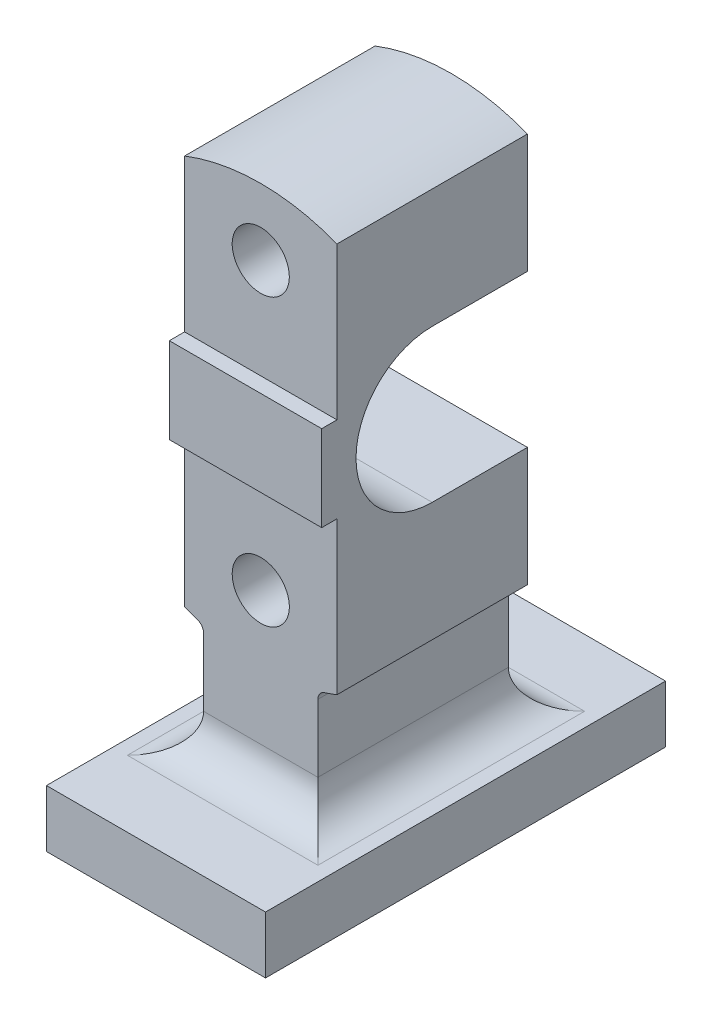
ISO-10303-21;
HEADER;
FILE_DESCRIPTION(('STEP AP214'),'2;1');
FILE_NAME('part.step','',(''),(''),'','','');
FILE_SCHEMA(('AUTOMOTIVE_DESIGN { 1 0 10303 214 1 1 1 1 }'));
ENDSEC;
DATA;
#1=APPLICATION_CONTEXT('core data for automotive mechanical design processes');
#2=APPLICATION_PROTOCOL_DEFINITION('international standard','automotive_design',2000,#1);
#3=PRODUCT_CONTEXT('',#1,'mechanical');
#4=PRODUCT('Part','Part','',(#3));
#5=PRODUCT_RELATED_PRODUCT_CATEGORY('part','',(#4));
#6=PRODUCT_DEFINITION_FORMATION('','',#4);
#7=PRODUCT_DEFINITION_CONTEXT('part definition',#1,'design');
#8=PRODUCT_DEFINITION('design','',#6,#7);
#9=PRODUCT_DEFINITION_SHAPE('','',#8);
#10=(LENGTH_UNIT() NAMED_UNIT(*) SI_UNIT(.MILLI.,.METRE.));
#11=(NAMED_UNIT(*) PLANE_ANGLE_UNIT() SI_UNIT($,.RADIAN.));
#12=(NAMED_UNIT(*) SI_UNIT($,.STERADIAN.) SOLID_ANGLE_UNIT());
#13=UNCERTAINTY_MEASURE_WITH_UNIT(LENGTH_MEASURE(1.E-05),#10,'distance_accuracy_value','');
#14=(GEOMETRIC_REPRESENTATION_CONTEXT(3) GLOBAL_UNCERTAINTY_ASSIGNED_CONTEXT((#13)) GLOBAL_UNIT_ASSIGNED_CONTEXT((#10,
#11,#12)) REPRESENTATION_CONTEXT('',''));
#15=CARTESIAN_POINT('',(0.,0.,0.));
#16=DIRECTION('',(0.,0.,1.));
#17=DIRECTION('',(1.,0.,0.));
#18=AXIS2_PLACEMENT_3D('',#15,#16,#17);
#19=CARTESIAN_POINT('',(0.,0.,0.));
#20=DIRECTION('',(0.,0.,1.));
#21=DIRECTION('',(1.,0.,0.));
#22=AXIS2_PLACEMENT_3D('',#19,#20,#21);
#23=PLANE('',#22);
#24=CARTESIAN_POINT('',(0.,-75.,0.));
#25=DIRECTION('',(0.,0.,1.));
#26=DIRECTION('',(-1.,0.,0.));
#27=AXIS2_PLACEMENT_3D('',#24,#25,#26);
#28=CIRCLE('',#27,15.);
#29=CARTESIAN_POINT('',(-15.,-75.,0.));
#30=VERTEX_POINT('',#29);
#31=EDGE_CURVE('E320',#30,#30,#28,.T.);
#32=ORIENTED_EDGE('',*,*,#31,.T.);
#33=EDGE_LOOP('',(#32));
#34=FACE_BOUND('',#33,.T.);
#35=DIRECTION('',(0.,-1.,0.));
#36=VECTOR('',#35,1.);
#37=CARTESIAN_POINT('',(-40.,102.469507659596,0.));
#38=LINE('',#37,#36);
#39=CARTESIAN_POINT('',(-40.,-40.,0.));
#40=VERTEX_POINT('',#39);
#41=CARTESIAN_POINT('',(-40.,-102.469507659596,0.));
#42=VERTEX_POINT('',#41);
#43=EDGE_CURVE('E397',#40,#42,#38,.T.);
#44=ORIENTED_EDGE('',*,*,#43,.F.);
#45=DIRECTION('',(1.,0.,0.));
#46=VECTOR('',#45,1.);
#47=CARTESIAN_POINT('',(0.,-40.,0.));
#48=LINE('',#47,#46);
#49=CARTESIAN_POINT('',(40.,-40.,0.));
#50=VERTEX_POINT('',#49);
#51=EDGE_CURVE('E213',#40,#50,#48,.T.);
#52=ORIENTED_EDGE('',*,*,#51,.T.);
#53=DIRECTION('',(0.,1.,0.));
#54=VECTOR('',#53,1.);
#55=CARTESIAN_POINT('',(40.,102.469507659596,0.));
#56=LINE('',#55,#54);
#57=CARTESIAN_POINT('',(40.,-102.469507659596,0.));
#58=VERTEX_POINT('',#57);
#59=EDGE_CURVE('E390',#58,#50,#56,.T.);
#60=ORIENTED_EDGE('',*,*,#59,.F.);
#61=CARTESIAN_POINT('',(0.,0.,0.));
#62=DIRECTION('',(0.,0.,1.));
#63=DIRECTION('',(1.,0.,0.));
#64=AXIS2_PLACEMENT_3D('',#61,#62,#63);
#65=CIRCLE('',#64,110.);
#66=CARTESIAN_POINT('',(33.4782608695652,-104.781706653162,0.));
#67=VERTEX_POINT('',#66);
#68=EDGE_CURVE('E386',#67,#58,#65,.T.);
#69=ORIENTED_EDGE('',*,*,#68,.F.);
#70=CARTESIAN_POINT('',(35.,-109.544511501033,0.));
#71=DIRECTION('',(0.,0.,-1.));
#72=DIRECTION('',(-1.,0.,0.));
#73=AXIS2_PLACEMENT_3D('',#70,#71,#72);
#74=CIRCLE('',#73,5.);
#75=CARTESIAN_POINT('',(30.,-109.544511501033,0.));
#76=VERTEX_POINT('',#75);
#77=EDGE_CURVE('E383',#76,#67,#74,.T.);
#78=ORIENTED_EDGE('',*,*,#77,.F.);
#79=DIRECTION('',(0.,1.,0.));
#80=VECTOR('',#79,1.);
#81=CARTESIAN_POINT('',(30.,-165.,0.));
#82=LINE('',#81,#80);
#83=CARTESIAN_POINT('',(30.,-145.,0.));
#84=VERTEX_POINT('',#83);
#85=EDGE_CURVE('E380',#84,#76,#82,.T.);
#86=ORIENTED_EDGE('',*,*,#85,.F.);
#87=DIRECTION('',(1.,0.,0.));
#88=VECTOR('',#87,1.);
#89=CARTESIAN_POINT('',(-30.,-145.,0.));
#90=LINE('',#89,#88);
#91=CARTESIAN_POINT('',(-30.,-145.,0.));
#92=VERTEX_POINT('',#91);
#93=EDGE_CURVE('E444',#84,#92,#90,.F.);
#94=ORIENTED_EDGE('',*,*,#93,.T.);
#95=DIRECTION('',(0.,-1.,0.));
#96=VECTOR('',#95,1.);
#97=CARTESIAN_POINT('',(-30.,-165.,0.));
#98=LINE('',#97,#96);
#99=CARTESIAN_POINT('',(-30.,-109.544511501033,0.));
#100=VERTEX_POINT('',#99);
#101=EDGE_CURVE('E376',#100,#92,#98,.T.);
#102=ORIENTED_EDGE('',*,*,#101,.F.);
#103=CARTESIAN_POINT('',(-35.,-109.544511501033,0.));
#104=DIRECTION('',(0.,0.,-1.));
#105=DIRECTION('',(1.,0.,0.));
#106=AXIS2_PLACEMENT_3D('',#103,#104,#105);
#107=CIRCLE('',#106,5.);
#108=CARTESIAN_POINT('',(-33.4782608695652,-104.781706653162,0.));
#109=VERTEX_POINT('',#108);
#110=EDGE_CURVE('E373',#109,#100,#107,.T.);
#111=ORIENTED_EDGE('',*,*,#110,.F.);
#112=CARTESIAN_POINT('',(0.,0.,0.));
#113=DIRECTION('',(0.,0.,1.));
#114=DIRECTION('',(1.,0.,0.));
#115=AXIS2_PLACEMENT_3D('',#112,#113,#114);
#116=CIRCLE('',#115,110.);
#117=EDGE_CURVE('E333',#42,#109,#116,.T.);
#118=ORIENTED_EDGE('',*,*,#117,.F.);
#119=EDGE_LOOP('',(#44,#52,#60,#69,#78,#86,#94,#102,#111,#118));
#120=FACE_BOUND('',#119,.T.);
#121=ADVANCED_FACE('F39',(#34,#120),#23,.F.);
#122=CARTESIAN_POINT('',(0.,0.,100.));
#123=DIRECTION('',(0.,0.,1.));
#124=DIRECTION('',(1.,0.,0.));
#125=AXIS2_PLACEMENT_3D('',#122,#123,#124);
#126=PLANE('',#125);
#127=CARTESIAN_POINT('',(0.,75.,100.));
#128=DIRECTION('',(0.,0.,1.));
#129=DIRECTION('',(1.,0.,0.));
#130=AXIS2_PLACEMENT_3D('',#127,#128,#129);
#131=CIRCLE('',#130,15.);
#132=CARTESIAN_POINT('',(15.,75.,100.));
#133=VERTEX_POINT('',#132);
#134=EDGE_CURVE('E329',#133,#133,#131,.T.);
#135=ORIENTED_EDGE('',*,*,#134,.F.);
#136=EDGE_LOOP('',(#135));
#137=FACE_BOUND('',#136,.T.);
#138=DIRECTION('',(0.,-1.,0.));
#139=VECTOR('',#138,1.);
#140=CARTESIAN_POINT('',(-40.,102.469507659596,100.));
#141=LINE('',#140,#139);
#142=CARTESIAN_POINT('',(-40.,102.469507659596,100.));
#143=VERTEX_POINT('',#142);
#144=CARTESIAN_POINT('',(-40.,22.5,100.));
#145=VERTEX_POINT('',#144);
#146=EDGE_CURVE('E366',#143,#145,#141,.T.);
#147=ORIENTED_EDGE('',*,*,#146,.T.);
#148=DIRECTION('',(-1.,0.,0.));
#149=VECTOR('',#148,1.);
#150=CARTESIAN_POINT('',(-40.,22.5,100.));
#151=LINE('',#150,#149);
#152=CARTESIAN_POINT('',(40.,22.5,100.));
#153=VERTEX_POINT('',#152);
#154=EDGE_CURVE('E63',#153,#145,#151,.T.);
#155=ORIENTED_EDGE('',*,*,#154,.F.);
#156=DIRECTION('',(0.,1.,0.));
#157=VECTOR('',#156,1.);
#158=CARTESIAN_POINT('',(40.,102.469507659596,100.));
#159=LINE('',#158,#157);
#160=CARTESIAN_POINT('',(40.,102.469507659596,100.));
#161=VERTEX_POINT('',#160);
#162=EDGE_CURVE('E358',#153,#161,#159,.T.);
#163=ORIENTED_EDGE('',*,*,#162,.T.);
#164=CARTESIAN_POINT('',(0.,0.,100.));
#165=DIRECTION('',(0.,0.,1.));
#166=DIRECTION('',(1.,0.,0.));
#167=AXIS2_PLACEMENT_3D('',#164,#165,#166);
#168=CIRCLE('',#167,110.);
#169=EDGE_CURVE('E362',#161,#143,#168,.T.);
#170=ORIENTED_EDGE('',*,*,#169,.T.);
#171=EDGE_LOOP('',(#147,#155,#163,#170));
#172=FACE_BOUND('',#171,.T.);
#173=ADVANCED_FACE('F565',(#137,#172),#126,.T.);
#174=CARTESIAN_POINT('',(0.,-75.,100.));
#175=DIRECTION('',(0.,0.,1.));
#176=DIRECTION('',(-1.,0.,0.));
#177=AXIS2_PLACEMENT_3D('',#174,#175,#176);
#178=CIRCLE('',#177,15.);
#179=CARTESIAN_POINT('',(-15.,-75.,100.));
#180=VERTEX_POINT('',#179);
#181=EDGE_CURVE('E321',#180,#180,#178,.T.);
#182=ORIENTED_EDGE('',*,*,#181,.F.);
#183=EDGE_LOOP('',(#182));
#184=FACE_BOUND('',#183,.T.);
#185=CARTESIAN_POINT('',(40.,-102.469507659596,100.));
#186=VERTEX_POINT('',#185);
#187=CARTESIAN_POINT('',(40.,-22.5,100.));
#188=VERTEX_POINT('',#187);
#189=EDGE_CURVE('E359',#186,#188,#159,.T.);
#190=ORIENTED_EDGE('',*,*,#189,.T.);
#191=DIRECTION('',(1.,0.,0.));
#192=VECTOR('',#191,1.);
#193=CARTESIAN_POINT('',(-40.,-22.5,100.));
#194=LINE('',#193,#192);
#195=CARTESIAN_POINT('',(-40.,-22.5,100.));
#196=VERTEX_POINT('',#195);
#197=EDGE_CURVE('E246',#196,#188,#194,.T.);
#198=ORIENTED_EDGE('',*,*,#197,.F.);
#199=CARTESIAN_POINT('',(-40.,-102.469507659596,100.));
#200=VERTEX_POINT('',#199);
#201=EDGE_CURVE('E365',#196,#200,#141,.T.);
#202=ORIENTED_EDGE('',*,*,#201,.T.);
#203=CARTESIAN_POINT('',(0.,0.,100.));
#204=DIRECTION('',(0.,0.,1.));
#205=DIRECTION('',(1.,0.,0.));
#206=AXIS2_PLACEMENT_3D('',#203,#204,#205);
#207=CIRCLE('',#206,110.);
#208=CARTESIAN_POINT('',(-33.4782608695652,-104.781706653162,100.));
#209=VERTEX_POINT('',#208);
#210=EDGE_CURVE('E337',#200,#209,#207,.T.);
#211=ORIENTED_EDGE('',*,*,#210,.T.);
#212=CARTESIAN_POINT('',(-35.,-109.544511501033,100.));
#213=DIRECTION('',(0.,0.,-1.));
#214=DIRECTION('',(1.,0.,0.));
#215=AXIS2_PLACEMENT_3D('',#212,#213,#214);
#216=CIRCLE('',#215,5.);
#217=CARTESIAN_POINT('',(-30.,-109.544511501033,100.));
#218=VERTEX_POINT('',#217);
#219=EDGE_CURVE('E341',#209,#218,#216,.T.);
#220=ORIENTED_EDGE('',*,*,#219,.T.);
#221=DIRECTION('',(0.,-1.,0.));
#222=VECTOR('',#221,1.);
#223=CARTESIAN_POINT('',(-30.,-165.,100.));
#224=LINE('',#223,#222);
#225=CARTESIAN_POINT('',(-30.,-145.,100.));
#226=VERTEX_POINT('',#225);
#227=EDGE_CURVE('E345',#218,#226,#224,.T.);
#228=ORIENTED_EDGE('',*,*,#227,.T.);
#229=DIRECTION('',(1.,0.,0.));
#230=VECTOR('',#229,1.);
#231=CARTESIAN_POINT('',(0.,-145.,100.));
#232=LINE('',#231,#230);
#233=CARTESIAN_POINT('',(30.,-145.,100.));
#234=VERTEX_POINT('',#233);
#235=EDGE_CURVE('E48',#226,#234,#232,.T.);
#236=ORIENTED_EDGE('',*,*,#235,.T.);
#237=DIRECTION('',(0.,1.,0.));
#238=VECTOR('',#237,1.);
#239=CARTESIAN_POINT('',(30.,-165.,100.));
#240=LINE('',#239,#238);
#241=CARTESIAN_POINT('',(30.,-109.544511501033,100.));
#242=VERTEX_POINT('',#241);
#243=EDGE_CURVE('E349',#234,#242,#240,.T.);
#244=ORIENTED_EDGE('',*,*,#243,.T.);
#245=CARTESIAN_POINT('',(35.,-109.544511501033,100.));
#246=DIRECTION('',(0.,0.,-1.));
#247=DIRECTION('',(-1.,0.,0.));
#248=AXIS2_PLACEMENT_3D('',#245,#246,#247);
#249=CIRCLE('',#248,5.);
#250=CARTESIAN_POINT('',(33.4782608695652,-104.781706653162,100.));
#251=VERTEX_POINT('',#250);
#252=EDGE_CURVE('E352',#242,#251,#249,.T.);
#253=ORIENTED_EDGE('',*,*,#252,.T.);
#254=CARTESIAN_POINT('',(0.,0.,100.));
#255=DIRECTION('',(0.,0.,1.));
#256=DIRECTION('',(1.,0.,0.));
#257=AXIS2_PLACEMENT_3D('',#254,#255,#256);
#258=CIRCLE('',#257,110.);
#259=EDGE_CURVE('E355',#251,#186,#258,.T.);
#260=ORIENTED_EDGE('',*,*,#259,.T.);
#261=EDGE_LOOP('',(#190,#198,#202,#211,#220,#228,#236,#244,#253,#260));
#262=FACE_BOUND('',#261,.T.);
#263=ADVANCED_FACE('F479',(#184,#262),#126,.T.);
#264=CARTESIAN_POINT('',(40.,40.,0.));
#265=VERTEX_POINT('',#264);
#266=CARTESIAN_POINT('',(40.,102.469507659596,0.));
#267=VERTEX_POINT('',#266);
#268=EDGE_CURVE('E389',#265,#267,#56,.T.);
#269=ORIENTED_EDGE('',*,*,#268,.F.);
#270=DIRECTION('',(-1.,0.,0.));
#271=VECTOR('',#270,1.);
#272=CARTESIAN_POINT('',(0.,40.,0.));
#273=LINE('',#272,#271);
#274=CARTESIAN_POINT('',(-40.,40.,0.));
#275=VERTEX_POINT('',#274);
#276=EDGE_CURVE('E230',#265,#275,#273,.T.);
#277=ORIENTED_EDGE('',*,*,#276,.T.);
#278=CARTESIAN_POINT('',(-40.,102.469507659596,0.));
#279=VERTEX_POINT('',#278);
#280=EDGE_CURVE('E342',#279,#275,#38,.T.);
#281=ORIENTED_EDGE('',*,*,#280,.F.);
#282=CARTESIAN_POINT('',(0.,0.,0.));
#283=DIRECTION('',(0.,0.,1.));
#284=DIRECTION('',(1.,0.,0.));
#285=AXIS2_PLACEMENT_3D('',#282,#283,#284);
#286=CIRCLE('',#285,110.);
#287=EDGE_CURVE('E394',#267,#279,#286,.T.);
#288=ORIENTED_EDGE('',*,*,#287,.F.);
#289=EDGE_LOOP('',(#269,#277,#281,#288));
#290=FACE_BOUND('',#289,.T.);
#291=CARTESIAN_POINT('',(0.,75.,0.));
#292=DIRECTION('',(0.,0.,1.));
#293=DIRECTION('',(1.,0.,0.));
#294=AXIS2_PLACEMENT_3D('',#291,#292,#293);
#295=CIRCLE('',#294,15.);
#296=CARTESIAN_POINT('',(15.,75.,0.));
#297=VERTEX_POINT('',#296);
#298=EDGE_CURVE('E325',#297,#297,#295,.T.);
#299=ORIENTED_EDGE('',*,*,#298,.T.);
#300=EDGE_LOOP('',(#299));
#301=FACE_BOUND('',#300,.T.);
#302=ADVANCED_FACE('F568',(#290,#301),#23,.F.);
#303=CARTESIAN_POINT('',(0.,0.,100.));
#304=DIRECTION('',(0.,0.,-1.));
#305=DIRECTION('',(-1.,0.,0.));
#306=AXIS2_PLACEMENT_3D('',#303,#304,#305);
#307=CYLINDRICAL_SURFACE('',#306,110.);
#308=ORIENTED_EDGE('',*,*,#117,.T.);
#309=DIRECTION('',(0.,0.,-1.));
#310=VECTOR('',#309,1.);
#311=CARTESIAN_POINT('',(-33.4782608695652,-104.781706653162,100.));
#312=LINE('',#311,#310);
#313=EDGE_CURVE('E427',#209,#109,#312,.T.);
#314=ORIENTED_EDGE('',*,*,#313,.F.);
#315=ORIENTED_EDGE('',*,*,#210,.F.);
#316=DIRECTION('',(0.,0.,-1.));
#317=VECTOR('',#316,1.);
#318=CARTESIAN_POINT('',(-40.,-102.469507659596,100.));
#319=LINE('',#318,#317);
#320=EDGE_CURVE('E369',#200,#42,#319,.T.);
#321=ORIENTED_EDGE('',*,*,#320,.T.);
#322=EDGE_LOOP('',(#308,#314,#315,#321));
#323=FACE_BOUND('',#322,.T.);
#324=ADVANCED_FACE('F513',(#323),#307,.T.);
#325=CARTESIAN_POINT('',(-35.,-109.544511501033,100.));
#326=DIRECTION('',(0.,0.,-1.));
#327=DIRECTION('',(-1.,0.,0.));
#328=AXIS2_PLACEMENT_3D('',#325,#326,#327);
#329=CYLINDRICAL_SURFACE('',#328,5.);
#330=ORIENTED_EDGE('',*,*,#110,.T.);
#331=DIRECTION('',(0.,0.,-1.));
#332=VECTOR('',#331,1.);
#333=CARTESIAN_POINT('',(-30.,-109.544511501033,100.));
#334=LINE('',#333,#332);
#335=EDGE_CURVE('E423',#218,#100,#334,.T.);
#336=ORIENTED_EDGE('',*,*,#335,.F.);
#337=ORIENTED_EDGE('',*,*,#219,.F.);
#338=ORIENTED_EDGE('',*,*,#313,.T.);
#339=EDGE_LOOP('',(#330,#336,#337,#338));
#340=FACE_BOUND('',#339,.T.);
#341=ADVANCED_FACE('F515',(#340),#329,.F.);
#342=CARTESIAN_POINT('',(-30.,-165.,100.));
#343=DIRECTION('',(1.,0.,0.));
#344=DIRECTION('',(0.,0.,-1.));
#345=AXIS2_PLACEMENT_3D('',#342,#343,#344);
#346=PLANE('',#345);
#347=ORIENTED_EDGE('',*,*,#101,.T.);
#348=DIRECTION('',(0.,0.,-1.));
#349=VECTOR('',#348,1.);
#350=CARTESIAN_POINT('',(-30.,-145.,100.));
#351=LINE('',#350,#349);
#352=EDGE_CURVE('E448',#92,#226,#351,.F.);
#353=ORIENTED_EDGE('',*,*,#352,.T.);
#354=ORIENTED_EDGE('',*,*,#227,.F.);
#355=ORIENTED_EDGE('',*,*,#335,.T.);
#356=EDGE_LOOP('',(#347,#353,#354,#355));
#357=FACE_BOUND('',#356,.T.);
#358=ADVANCED_FACE('F519',(#357),#346,.F.);
#359=CARTESIAN_POINT('',(30.,-165.,100.));
#360=DIRECTION('',(-1.,0.,0.));
#361=DIRECTION('',(0.,0.,1.));
#362=AXIS2_PLACEMENT_3D('',#359,#360,#361);
#363=PLANE('',#362);
#364=ORIENTED_EDGE('',*,*,#243,.F.);
#365=DIRECTION('',(0.,0.,-1.));
#366=VECTOR('',#365,1.);
#367=CARTESIAN_POINT('',(30.,-145.,0.));
#368=LINE('',#367,#366);
#369=EDGE_CURVE('E451',#234,#84,#368,.T.);
#370=ORIENTED_EDGE('',*,*,#369,.T.);
#371=ORIENTED_EDGE('',*,*,#85,.T.);
#372=DIRECTION('',(0.,0.,-1.));
#373=VECTOR('',#372,1.);
#374=CARTESIAN_POINT('',(30.,-109.544511501033,100.));
#375=LINE('',#374,#373);
#376=EDGE_CURVE('E419',#242,#76,#375,.T.);
#377=ORIENTED_EDGE('',*,*,#376,.F.);
#378=EDGE_LOOP('',(#364,#370,#371,#377));
#379=FACE_BOUND('',#378,.T.);
#380=ADVANCED_FACE('F483',(#379),#363,.F.);
#381=CARTESIAN_POINT('',(35.,-109.544511501033,100.));
#382=DIRECTION('',(0.,0.,-1.));
#383=DIRECTION('',(-1.,0.,0.));
#384=AXIS2_PLACEMENT_3D('',#381,#382,#383);
#385=CYLINDRICAL_SURFACE('',#384,5.);
#386=ORIENTED_EDGE('',*,*,#77,.T.);
#387=DIRECTION('',(0.,0.,-1.));
#388=VECTOR('',#387,1.);
#389=CARTESIAN_POINT('',(33.4782608695652,-104.781706653162,100.));
#390=LINE('',#389,#388);
#391=EDGE_CURVE('E415',#251,#67,#390,.T.);
#392=ORIENTED_EDGE('',*,*,#391,.F.);
#393=ORIENTED_EDGE('',*,*,#252,.F.);
#394=ORIENTED_EDGE('',*,*,#376,.T.);
#395=EDGE_LOOP('',(#386,#392,#393,#394));
#396=FACE_BOUND('',#395,.T.);
#397=ADVANCED_FACE('F489',(#396),#385,.F.);
#398=CARTESIAN_POINT('',(0.,0.,100.));
#399=DIRECTION('',(0.,0.,-1.));
#400=DIRECTION('',(-1.,0.,0.));
#401=AXIS2_PLACEMENT_3D('',#398,#399,#400);
#402=CYLINDRICAL_SURFACE('',#401,110.);
#403=ORIENTED_EDGE('',*,*,#68,.T.);
#404=DIRECTION('',(0.,0.,-1.));
#405=VECTOR('',#404,1.);
#406=CARTESIAN_POINT('',(40.,-102.469507659596,100.));
#407=LINE('',#406,#405);
#408=EDGE_CURVE('E411',#186,#58,#407,.T.);
#409=ORIENTED_EDGE('',*,*,#408,.F.);
#410=ORIENTED_EDGE('',*,*,#259,.F.);
#411=ORIENTED_EDGE('',*,*,#391,.T.);
#412=EDGE_LOOP('',(#403,#409,#410,#411));
#413=FACE_BOUND('',#412,.T.);
#414=ADVANCED_FACE('F495',(#413),#402,.T.);
#415=CARTESIAN_POINT('',(40.,102.469507659596,100.));
#416=DIRECTION('',(-1.,0.,0.));
#417=DIRECTION('',(0.,0.,1.));
#418=AXIS2_PLACEMENT_3D('',#415,#416,#417);
#419=PLANE('',#418);
#420=ORIENTED_EDGE('',*,*,#59,.T.);
#421=DIRECTION('',(0.,0.,1.));
#422=VECTOR('',#421,1.);
#423=CARTESIAN_POINT('',(40.,-40.,100.));
#424=LINE('',#423,#422);
#425=CARTESIAN_POINT('',(40.,-40.,50.));
#426=VERTEX_POINT('',#425);
#427=EDGE_CURVE('E234',#50,#426,#424,.T.);
#428=ORIENTED_EDGE('',*,*,#427,.T.);
#429=CARTESIAN_POINT('',(40.,0.,50.));
#430=DIRECTION('',(-1.,0.,0.));
#431=DIRECTION('',(0.,0.,1.));
#432=AXIS2_PLACEMENT_3D('',#429,#430,#431);
#433=CIRCLE('',#432,40.);
#434=CARTESIAN_POINT('',(40.,40.,50.));
#435=VERTEX_POINT('',#434);
#436=EDGE_CURVE('E204',#426,#435,#433,.T.);
#437=ORIENTED_EDGE('',*,*,#436,.T.);
#438=DIRECTION('',(0.,0.,-1.));
#439=VECTOR('',#438,1.);
#440=CARTESIAN_POINT('',(40.,40.,100.));
#441=LINE('',#440,#439);
#442=EDGE_CURVE('E208',#435,#265,#441,.T.);
#443=ORIENTED_EDGE('',*,*,#442,.T.);
#444=ORIENTED_EDGE('',*,*,#268,.T.);
#445=DIRECTION('',(0.,0.,-1.));
#446=VECTOR('',#445,1.);
#447=CARTESIAN_POINT('',(40.,102.469507659596,100.));
#448=LINE('',#447,#446);
#449=EDGE_CURVE('E407',#161,#267,#448,.T.);
#450=ORIENTED_EDGE('',*,*,#449,.F.);
#451=ORIENTED_EDGE('',*,*,#162,.F.);
#452=DIRECTION('',(0.,0.,-1.));
#453=VECTOR('',#452,1.);
#454=CARTESIAN_POINT('',(40.,22.5,108.));
#455=LINE('',#454,#453);
#456=CARTESIAN_POINT('',(40.,22.5,108.));
#457=VERTEX_POINT('',#456);
#458=EDGE_CURVE('E272',#457,#153,#455,.T.);
#459=ORIENTED_EDGE('',*,*,#458,.F.);
#460=DIRECTION('',(0.,1.,0.));
#461=VECTOR('',#460,1.);
#462=CARTESIAN_POINT('',(40.,-22.5,108.));
#463=LINE('',#462,#461);
#464=CARTESIAN_POINT('',(40.,-22.5,108.));
#465=VERTEX_POINT('',#464);
#466=EDGE_CURVE('E241',#465,#457,#463,.T.);
#467=ORIENTED_EDGE('',*,*,#466,.F.);
#468=DIRECTION('',(0.,0.,-1.));
#469=VECTOR('',#468,1.);
#470=CARTESIAN_POINT('',(40.,-22.5,108.));
#471=LINE('',#470,#469);
#472=EDGE_CURVE('E255',#465,#188,#471,.T.);
#473=ORIENTED_EDGE('',*,*,#472,.T.);
#474=ORIENTED_EDGE('',*,*,#189,.F.);
#475=ORIENTED_EDGE('',*,*,#408,.T.);
#476=EDGE_LOOP('',(#420,#428,#437,#443,#444,#450,#451,#459,#467,#473,#474,#475));
#477=FACE_BOUND('',#476,.T.);
#478=ADVANCED_FACE('F499',(#477),#419,.F.);
#479=CARTESIAN_POINT('',(0.,0.,100.));
#480=DIRECTION('',(0.,0.,-1.));
#481=DIRECTION('',(-1.,0.,0.));
#482=AXIS2_PLACEMENT_3D('',#479,#480,#481);
#483=CYLINDRICAL_SURFACE('',#482,110.);
#484=ORIENTED_EDGE('',*,*,#287,.T.);
#485=DIRECTION('',(0.,0.,-1.));
#486=VECTOR('',#485,1.);
#487=CARTESIAN_POINT('',(-40.,102.469507659596,100.));
#488=LINE('',#487,#486);
#489=EDGE_CURVE('E403',#143,#279,#488,.T.);
#490=ORIENTED_EDGE('',*,*,#489,.F.);
#491=ORIENTED_EDGE('',*,*,#169,.F.);
#492=ORIENTED_EDGE('',*,*,#449,.T.);
#493=EDGE_LOOP('',(#484,#490,#491,#492));
#494=FACE_BOUND('',#493,.T.);
#495=ADVANCED_FACE('F598',(#494),#483,.T.);
#496=CARTESIAN_POINT('',(-40.,102.469507659596,100.));
#497=DIRECTION('',(1.,0.,0.));
#498=DIRECTION('',(0.,0.,-1.));
#499=AXIS2_PLACEMENT_3D('',#496,#497,#498);
#500=PLANE('',#499);
#501=CARTESIAN_POINT('',(-40.,0.,50.));
#502=DIRECTION('',(-1.,0.,0.));
#503=DIRECTION('',(0.,0.,-1.));
#504=AXIS2_PLACEMENT_3D('',#501,#502,#503);
#505=CIRCLE('',#504,40.);
#506=CARTESIAN_POINT('',(-40.,-40.,50.));
#507=VERTEX_POINT('',#506);
#508=CARTESIAN_POINT('',(-40.,40.,50.));
#509=VERTEX_POINT('',#508);
#510=EDGE_CURVE('E55',#507,#509,#505,.T.);
#511=ORIENTED_EDGE('',*,*,#510,.F.);
#512=DIRECTION('',(0.,0.,-1.));
#513=VECTOR('',#512,1.);
#514=CARTESIAN_POINT('',(-40.,-40.,100.));
#515=LINE('',#514,#513);
#516=EDGE_CURVE('E11',#507,#40,#515,.T.);
#517=ORIENTED_EDGE('',*,*,#516,.T.);
#518=ORIENTED_EDGE('',*,*,#43,.T.);
#519=ORIENTED_EDGE('',*,*,#320,.F.);
#520=ORIENTED_EDGE('',*,*,#201,.F.);
#521=DIRECTION('',(0.,0.,-1.));
#522=VECTOR('',#521,1.);
#523=CARTESIAN_POINT('',(-40.,-22.5,108.));
#524=LINE('',#523,#522);
#525=CARTESIAN_POINT('',(-40.,-22.5,108.));
#526=VERTEX_POINT('',#525);
#527=EDGE_CURVE('E264',#526,#196,#524,.T.);
#528=ORIENTED_EDGE('',*,*,#527,.F.);
#529=DIRECTION('',(0.,-1.,0.));
#530=VECTOR('',#529,1.);
#531=CARTESIAN_POINT('',(-40.,-22.5,108.));
#532=LINE('',#531,#530);
#533=CARTESIAN_POINT('',(-40.,22.5,108.));
#534=VERTEX_POINT('',#533);
#535=EDGE_CURVE('E249',#534,#526,#532,.T.);
#536=ORIENTED_EDGE('',*,*,#535,.F.);
#537=DIRECTION('',(0.,0.,-1.));
#538=VECTOR('',#537,1.);
#539=CARTESIAN_POINT('',(-40.,22.5,108.));
#540=LINE('',#539,#538);
#541=EDGE_CURVE('E268',#534,#145,#540,.T.);
#542=ORIENTED_EDGE('',*,*,#541,.T.);
#543=ORIENTED_EDGE('',*,*,#146,.F.);
#544=ORIENTED_EDGE('',*,*,#489,.T.);
#545=ORIENTED_EDGE('',*,*,#280,.T.);
#546=DIRECTION('',(0.,0.,-1.));
#547=VECTOR('',#546,1.);
#548=CARTESIAN_POINT('',(-40.,40.,-70.));
#549=LINE('',#548,#547);
#550=EDGE_CURVE('E219',#509,#275,#549,.T.);
#551=ORIENTED_EDGE('',*,*,#550,.F.);
#552=EDGE_LOOP('',(#511,#517,#518,#519,#520,#528,#536,#542,#543,#544,#545,#551));
#553=FACE_BOUND('',#552,.T.);
#554=ADVANCED_FACE('F217',(#553),#500,.F.);
#555=CARTESIAN_POINT('',(0.,75.,100.));
#556=DIRECTION('',(0.,0.,-1.));
#557=DIRECTION('',(-1.,0.,0.));
#558=AXIS2_PLACEMENT_3D('',#555,#556,#557);
#559=CYLINDRICAL_SURFACE('',#558,15.);
#560=ORIENTED_EDGE('',*,*,#134,.T.);
#561=EDGE_LOOP('',(#560));
#562=FACE_BOUND('',#561,.T.);
#563=ORIENTED_EDGE('',*,*,#298,.F.);
#564=EDGE_LOOP('',(#563));
#565=FACE_BOUND('',#564,.T.);
#566=ADVANCED_FACE('F588',(#562,#565),#559,.F.);
#567=CARTESIAN_POINT('',(0.,-75.,100.));
#568=DIRECTION('',(0.,0.,-1.));
#569=DIRECTION('',(-1.,0.,0.));
#570=AXIS2_PLACEMENT_3D('',#567,#568,#569);
#571=CYLINDRICAL_SURFACE('',#570,15.);
#572=ORIENTED_EDGE('',*,*,#181,.T.);
#573=EDGE_LOOP('',(#572));
#574=FACE_BOUND('',#573,.T.);
#575=ORIENTED_EDGE('',*,*,#31,.F.);
#576=EDGE_LOOP('',(#575));
#577=FACE_BOUND('',#576,.T.);
#578=ADVANCED_FACE('F534',(#574,#577),#571,.F.);
#579=CARTESIAN_POINT('',(-57.5000000000001,-165.,155.));
#580=DIRECTION('',(0.,-1.,0.));
#581=DIRECTION('',(0.,0.,-1.));
#582=AXIS2_PLACEMENT_3D('',#579,#580,#581);
#583=PLANE('',#582);
#584=DIRECTION('',(0.,0.,-1.));
#585=VECTOR('',#584,1.);
#586=CARTESIAN_POINT('',(-50.,-165.,0.));
#587=LINE('',#586,#585);
#588=CARTESIAN_POINT('',(-50.,-165.,120.));
#589=VERTEX_POINT('',#588);
#590=CARTESIAN_POINT('',(-50.,-165.,-20.));
#591=VERTEX_POINT('',#590);
#592=EDGE_CURVE('E437',#589,#591,#587,.T.);
#593=ORIENTED_EDGE('',*,*,#592,.T.);
#594=DIRECTION('',(1.,0.,0.));
#595=VECTOR('',#594,1.);
#596=CARTESIAN_POINT('',(30.,-165.,-20.));
#597=LINE('',#596,#595);
#598=CARTESIAN_POINT('',(50.,-165.,-20.));
#599=VERTEX_POINT('',#598);
#600=EDGE_CURVE('E440',#591,#599,#597,.T.);
#601=ORIENTED_EDGE('',*,*,#600,.T.);
#602=DIRECTION('',(0.,0.,-1.));
#603=VECTOR('',#602,1.);
#604=CARTESIAN_POINT('',(50.,-165.,100.));
#605=LINE('',#604,#603);
#606=CARTESIAN_POINT('',(50.,-165.,120.));
#607=VERTEX_POINT('',#606);
#608=EDGE_CURVE('E434',#599,#607,#605,.F.);
#609=ORIENTED_EDGE('',*,*,#608,.T.);
#610=DIRECTION('',(1.,0.,0.));
#611=VECTOR('',#610,1.);
#612=CARTESIAN_POINT('',(-57.5000000000001,-165.,120.));
#613=LINE('',#612,#611);
#614=EDGE_CURVE('E431',#607,#589,#613,.F.);
#615=ORIENTED_EDGE('',*,*,#614,.T.);
#616=EDGE_LOOP('',(#593,#601,#609,#615));
#617=FACE_BOUND('',#616,.T.);
#618=DIRECTION('',(-1.,0.,0.));
#619=VECTOR('',#618,1.);
#620=CARTESIAN_POINT('',(-57.5000000000001,-165.,-55.));
#621=LINE('',#620,#619);
#622=CARTESIAN_POINT('',(57.4999999999999,-165.,-55.));
#623=VERTEX_POINT('',#622);
#624=CARTESIAN_POINT('',(-57.5000000000001,-165.,-55.));
#625=VERTEX_POINT('',#624);
#626=EDGE_CURVE('E296',#623,#625,#621,.T.);
#627=ORIENTED_EDGE('',*,*,#626,.T.);
#628=DIRECTION('',(0.,0.,-1.));
#629=VECTOR('',#628,1.);
#630=CARTESIAN_POINT('',(-57.5000000000001,-165.,155.));
#631=LINE('',#630,#629);
#632=CARTESIAN_POINT('',(-57.5000000000001,-165.,155.));
#633=VERTEX_POINT('',#632);
#634=EDGE_CURVE('E312',#633,#625,#631,.T.);
#635=ORIENTED_EDGE('',*,*,#634,.F.);
#636=DIRECTION('',(-1.,0.,0.));
#637=VECTOR('',#636,1.);
#638=CARTESIAN_POINT('',(-57.5000000000001,-165.,155.));
#639=LINE('',#638,#637);
#640=CARTESIAN_POINT('',(57.4999999999999,-165.,155.));
#641=VERTEX_POINT('',#640);
#642=EDGE_CURVE('E281',#641,#633,#639,.T.);
#643=ORIENTED_EDGE('',*,*,#642,.F.);
#644=DIRECTION('',(0.,0.,-1.));
#645=VECTOR('',#644,1.);
#646=CARTESIAN_POINT('',(57.4999999999999,-165.,155.));
#647=LINE('',#646,#645);
#648=EDGE_CURVE('E316',#641,#623,#647,.T.);
#649=ORIENTED_EDGE('',*,*,#648,.T.);
#650=EDGE_LOOP('',(#627,#635,#643,#649));
#651=FACE_BOUND('',#650,.T.);
#652=ADVANCED_FACE('F530',(#617,#651),#583,.F.);
#653=CARTESIAN_POINT('',(57.4999999999999,-195.,155.));
#654=DIRECTION('',(-1.,0.,0.));
#655=DIRECTION('',(0.,0.,1.));
#656=AXIS2_PLACEMENT_3D('',#653,#654,#655);
#657=PLANE('',#656);
#658=DIRECTION('',(0.,1.,0.));
#659=VECTOR('',#658,1.);
#660=CARTESIAN_POINT('',(57.4999999999999,-195.,-55.));
#661=LINE('',#660,#659);
#662=CARTESIAN_POINT('',(57.4999999999999,-195.,-55.));
#663=VERTEX_POINT('',#662);
#664=EDGE_CURVE('E292',#663,#623,#661,.T.);
#665=ORIENTED_EDGE('',*,*,#664,.T.);
#666=ORIENTED_EDGE('',*,*,#648,.F.);
#667=DIRECTION('',(0.,1.,0.));
#668=VECTOR('',#667,1.);
#669=CARTESIAN_POINT('',(57.4999999999999,-195.,155.));
#670=LINE('',#669,#668);
#671=CARTESIAN_POINT('',(57.4999999999999,-195.,155.));
#672=VERTEX_POINT('',#671);
#673=EDGE_CURVE('E277',#672,#641,#670,.T.);
#674=ORIENTED_EDGE('',*,*,#673,.F.);
#675=DIRECTION('',(0.,0.,-1.));
#676=VECTOR('',#675,1.);
#677=CARTESIAN_POINT('',(57.4999999999999,-195.,155.));
#678=LINE('',#677,#676);
#679=EDGE_CURVE('E291',#672,#663,#678,.T.);
#680=ORIENTED_EDGE('',*,*,#679,.T.);
#681=EDGE_LOOP('',(#665,#666,#674,#680));
#682=FACE_BOUND('',#681,.T.);
#683=ADVANCED_FACE('F533',(#682),#657,.F.);
#684=CARTESIAN_POINT('',(-57.5000000000001,-195.,155.));
#685=DIRECTION('',(1.,0.,0.));
#686=DIRECTION('',(0.,0.,-1.));
#687=AXIS2_PLACEMENT_3D('',#684,#685,#686);
#688=PLANE('',#687);
#689=DIRECTION('',(0.,-1.,0.));
#690=VECTOR('',#689,1.);
#691=CARTESIAN_POINT('',(-57.5000000000001,-195.,-55.));
#692=LINE('',#691,#690);
#693=CARTESIAN_POINT('',(-57.5000000000001,-195.,-55.));
#694=VERTEX_POINT('',#693);
#695=EDGE_CURVE('E300',#625,#694,#692,.T.);
#696=ORIENTED_EDGE('',*,*,#695,.T.);
#697=DIRECTION('',(0.,0.,-1.));
#698=VECTOR('',#697,1.);
#699=CARTESIAN_POINT('',(-57.5000000000001,-195.,155.));
#700=LINE('',#699,#698);
#701=CARTESIAN_POINT('',(-57.5000000000001,-195.,155.));
#702=VERTEX_POINT('',#701);
#703=EDGE_CURVE('E308',#702,#694,#700,.T.);
#704=ORIENTED_EDGE('',*,*,#703,.F.);
#705=DIRECTION('',(0.,-1.,0.));
#706=VECTOR('',#705,1.);
#707=CARTESIAN_POINT('',(-57.5000000000001,-195.,155.));
#708=LINE('',#707,#706);
#709=EDGE_CURVE('E285',#633,#702,#708,.T.);
#710=ORIENTED_EDGE('',*,*,#709,.F.);
#711=ORIENTED_EDGE('',*,*,#634,.T.);
#712=EDGE_LOOP('',(#696,#704,#710,#711));
#713=FACE_BOUND('',#712,.T.);
#714=ADVANCED_FACE('F543',(#713),#688,.F.);
#715=CARTESIAN_POINT('',(-57.5000000000001,-195.,155.));
#716=DIRECTION('',(0.,1.,0.));
#717=DIRECTION('',(0.,0.,1.));
#718=AXIS2_PLACEMENT_3D('',#715,#716,#717);
#719=PLANE('',#718);
#720=DIRECTION('',(1.,0.,0.));
#721=VECTOR('',#720,1.);
#722=CARTESIAN_POINT('',(-57.5000000000001,-195.,-55.));
#723=LINE('',#722,#721);
#724=EDGE_CURVE('E282',#694,#663,#723,.T.);
#725=ORIENTED_EDGE('',*,*,#724,.T.);
#726=ORIENTED_EDGE('',*,*,#679,.F.);
#727=DIRECTION('',(1.,0.,0.));
#728=VECTOR('',#727,1.);
#729=CARTESIAN_POINT('',(-57.5000000000001,-195.,155.));
#730=LINE('',#729,#728);
#731=EDGE_CURVE('E288',#702,#672,#730,.T.);
#732=ORIENTED_EDGE('',*,*,#731,.F.);
#733=ORIENTED_EDGE('',*,*,#703,.T.);
#734=EDGE_LOOP('',(#725,#726,#732,#733));
#735=FACE_BOUND('',#734,.T.);
#736=ADVANCED_FACE('F549',(#735),#719,.F.);
#737=CARTESIAN_POINT('',(0.,0.,155.));
#738=DIRECTION('',(0.,0.,-1.));
#739=DIRECTION('',(-1.,0.,0.));
#740=AXIS2_PLACEMENT_3D('',#737,#738,#739);
#741=PLANE('',#740);
#742=ORIENTED_EDGE('',*,*,#673,.T.);
#743=ORIENTED_EDGE('',*,*,#642,.T.);
#744=ORIENTED_EDGE('',*,*,#709,.T.);
#745=ORIENTED_EDGE('',*,*,#731,.T.);
#746=EDGE_LOOP('',(#742,#743,#744,#745));
#747=FACE_BOUND('',#746,.T.);
#748=ADVANCED_FACE('F554',(#747),#741,.F.);
#749=CARTESIAN_POINT('',(0.,0.,-55.));
#750=DIRECTION('',(0.,0.,-1.));
#751=DIRECTION('',(-1.,0.,0.));
#752=AXIS2_PLACEMENT_3D('',#749,#750,#751);
#753=PLANE('',#752);
#754=ORIENTED_EDGE('',*,*,#664,.F.);
#755=ORIENTED_EDGE('',*,*,#724,.F.);
#756=ORIENTED_EDGE('',*,*,#695,.F.);
#757=ORIENTED_EDGE('',*,*,#626,.F.);
#758=EDGE_LOOP('',(#754,#755,#756,#757));
#759=FACE_BOUND('',#758,.T.);
#760=ADVANCED_FACE('F546',(#759),#753,.T.);
#761=CARTESIAN_POINT('',(0.,-145.,120.));
#762=DIRECTION('',(1.,0.,0.));
#763=DIRECTION('',(0.,0.,-1.));
#764=AXIS2_PLACEMENT_3D('',#761,#762,#763);
#765=CYLINDRICAL_SURFACE('',#764,20.);
#766=CARTESIAN_POINT('',(50.,-145.,120.));
#767=DIRECTION('',(0.707106781186547,0.,-0.707106781186547));
#768=DIRECTION('',(0.707106781186547,0.,0.707106781186547));
#769=AXIS2_PLACEMENT_3D('',#766,#767,#768);
#770=ELLIPSE('',#769,28.2842712474619,20.);
#771=EDGE_CURVE('E461',#234,#607,#770,.F.);
#772=ORIENTED_EDGE('',*,*,#771,.F.);
#773=ORIENTED_EDGE('',*,*,#235,.F.);
#774=CARTESIAN_POINT('',(-50.,-145.,120.));
#775=DIRECTION('',(0.707106781186547,0.,0.707106781186547));
#776=DIRECTION('',(0.707106781186547,0.,-0.707106781186547));
#777=AXIS2_PLACEMENT_3D('',#774,#775,#776);
#778=ELLIPSE('',#777,28.2842712474619,20.);
#779=EDGE_CURVE('E297',#589,#226,#778,.T.);
#780=ORIENTED_EDGE('',*,*,#779,.F.);
#781=ORIENTED_EDGE('',*,*,#614,.F.);
#782=EDGE_LOOP('',(#772,#773,#780,#781));
#783=FACE_BOUND('',#782,.T.);
#784=ADVANCED_FACE('F41',(#783),#765,.F.);
#785=CARTESIAN_POINT('',(-50.,-145.,155.));
#786=DIRECTION('',(0.,0.,1.));
#787=DIRECTION('',(1.,0.,0.));
#788=AXIS2_PLACEMENT_3D('',#785,#786,#787);
#789=CYLINDRICAL_SURFACE('',#788,20.);
#790=ORIENTED_EDGE('',*,*,#779,.T.);
#791=ORIENTED_EDGE('',*,*,#352,.F.);
#792=CARTESIAN_POINT('',(-50.,-145.,-20.));
#793=DIRECTION('',(-0.707106781186547,0.,0.707106781186547));
#794=DIRECTION('',(0.707106781186547,0.,0.707106781186547));
#795=AXIS2_PLACEMENT_3D('',#792,#793,#794);
#796=ELLIPSE('',#795,28.2842712474619,20.);
#797=EDGE_CURVE('E458',#591,#92,#796,.T.);
#798=ORIENTED_EDGE('',*,*,#797,.F.);
#799=ORIENTED_EDGE('',*,*,#592,.F.);
#800=EDGE_LOOP('',(#790,#791,#798,#799));
#801=FACE_BOUND('',#800,.T.);
#802=ADVANCED_FACE('F470',(#801),#789,.F.);
#803=CARTESIAN_POINT('',(50.,-145.,100.));
#804=DIRECTION('',(0.,0.,1.));
#805=DIRECTION('',(1.,0.,0.));
#806=AXIS2_PLACEMENT_3D('',#803,#804,#805);
#807=CYLINDRICAL_SURFACE('',#806,20.);
#808=ORIENTED_EDGE('',*,*,#771,.T.);
#809=ORIENTED_EDGE('',*,*,#608,.F.);
#810=CARTESIAN_POINT('',(50.,-145.,-20.));
#811=DIRECTION('',(0.707106781186547,0.,0.707106781186547));
#812=DIRECTION('',(-0.707106781186547,0.,0.707106781186547));
#813=AXIS2_PLACEMENT_3D('',#810,#811,#812);
#814=ELLIPSE('',#813,28.2842712474619,20.);
#815=EDGE_CURVE('E276',#84,#599,#814,.T.);
#816=ORIENTED_EDGE('',*,*,#815,.F.);
#817=ORIENTED_EDGE('',*,*,#369,.F.);
#818=EDGE_LOOP('',(#808,#809,#816,#817));
#819=FACE_BOUND('',#818,.T.);
#820=ADVANCED_FACE('F528',(#819),#807,.F.);
#821=CARTESIAN_POINT('',(-57.5000000000001,-145.,-20.));
#822=DIRECTION('',(-1.,0.,0.));
#823=DIRECTION('',(0.,0.,1.));
#824=AXIS2_PLACEMENT_3D('',#821,#822,#823);
#825=CYLINDRICAL_SURFACE('',#824,20.);
#826=ORIENTED_EDGE('',*,*,#797,.T.);
#827=ORIENTED_EDGE('',*,*,#93,.F.);
#828=ORIENTED_EDGE('',*,*,#815,.T.);
#829=ORIENTED_EDGE('',*,*,#600,.F.);
#830=EDGE_LOOP('',(#826,#827,#828,#829));
#831=FACE_BOUND('',#830,.T.);
#832=ADVANCED_FACE('F524',(#831),#825,.F.);
#833=CARTESIAN_POINT('',(-40.,22.5,108.));
#834=DIRECTION('',(0.,-1.,0.));
#835=DIRECTION('',(0.,0.,-1.));
#836=AXIS2_PLACEMENT_3D('',#833,#834,#835);
#837=PLANE('',#836);
#838=ORIENTED_EDGE('',*,*,#154,.T.);
#839=ORIENTED_EDGE('',*,*,#541,.F.);
#840=DIRECTION('',(-1.,0.,0.));
#841=VECTOR('',#840,1.);
#842=CARTESIAN_POINT('',(-40.,22.5,108.));
#843=LINE('',#842,#841);
#844=EDGE_CURVE('E245',#457,#534,#843,.T.);
#845=ORIENTED_EDGE('',*,*,#844,.F.);
#846=ORIENTED_EDGE('',*,*,#458,.T.);
#847=EDGE_LOOP('',(#838,#839,#845,#846));
#848=FACE_BOUND('',#847,.T.);
#849=ADVANCED_FACE('F680',(#848),#837,.F.);
#850=CARTESIAN_POINT('',(-40.,-22.5,108.));
#851=DIRECTION('',(0.,1.,0.));
#852=DIRECTION('',(0.,0.,1.));
#853=AXIS2_PLACEMENT_3D('',#850,#851,#852);
#854=PLANE('',#853);
#855=ORIENTED_EDGE('',*,*,#197,.T.);
#856=ORIENTED_EDGE('',*,*,#472,.F.);
#857=DIRECTION('',(1.,0.,0.));
#858=VECTOR('',#857,1.);
#859=CARTESIAN_POINT('',(-40.,-22.5,108.));
#860=LINE('',#859,#858);
#861=EDGE_CURVE('E252',#526,#465,#860,.T.);
#862=ORIENTED_EDGE('',*,*,#861,.F.);
#863=ORIENTED_EDGE('',*,*,#527,.T.);
#864=EDGE_LOOP('',(#855,#856,#862,#863));
#865=FACE_BOUND('',#864,.T.);
#866=ADVANCED_FACE('F505',(#865),#854,.F.);
#867=CARTESIAN_POINT('',(0.,0.,108.));
#868=DIRECTION('',(0.,0.,-1.));
#869=DIRECTION('',(-1.,0.,0.));
#870=AXIS2_PLACEMENT_3D('',#867,#868,#869);
#871=PLANE('',#870);
#872=ORIENTED_EDGE('',*,*,#466,.T.);
#873=ORIENTED_EDGE('',*,*,#844,.T.);
#874=ORIENTED_EDGE('',*,*,#535,.T.);
#875=ORIENTED_EDGE('',*,*,#861,.T.);
#876=EDGE_LOOP('',(#872,#873,#874,#875));
#877=FACE_BOUND('',#876,.T.);
#878=ADVANCED_FACE('F711',(#877),#871,.F.);
#879=CARTESIAN_POINT('',(57.4999999999999,0.,50.));
#880=DIRECTION('',(-1.,0.,0.));
#881=DIRECTION('',(0.,0.,1.));
#882=AXIS2_PLACEMENT_3D('',#879,#880,#881);
#883=CYLINDRICAL_SURFACE('',#882,40.);
#884=DIRECTION('',(-1.,0.,0.));
#885=VECTOR('',#884,1.);
#886=CARTESIAN_POINT('',(57.4999999999999,-40.,50.));
#887=LINE('',#886,#885);
#888=EDGE_CURVE('E200',#426,#507,#887,.T.);
#889=ORIENTED_EDGE('',*,*,#888,.T.);
#890=ORIENTED_EDGE('',*,*,#510,.T.);
#891=DIRECTION('',(-1.,0.,0.));
#892=VECTOR('',#891,1.);
#893=CARTESIAN_POINT('',(57.4999999999999,40.,50.));
#894=LINE('',#893,#892);
#895=EDGE_CURVE('E209',#435,#509,#894,.T.);
#896=ORIENTED_EDGE('',*,*,#895,.F.);
#897=ORIENTED_EDGE('',*,*,#436,.F.);
#898=EDGE_LOOP('',(#889,#890,#896,#897));
#899=FACE_BOUND('',#898,.T.);
#900=ADVANCED_FACE('F202',(#899),#883,.F.);
#901=CARTESIAN_POINT('',(57.4999999999999,-40.,-70.));
#902=DIRECTION('',(0.,-1.,0.));
#903=DIRECTION('',(0.,0.,-1.));
#904=AXIS2_PLACEMENT_3D('',#901,#902,#903);
#905=PLANE('',#904);
#906=ORIENTED_EDGE('',*,*,#516,.F.);
#907=ORIENTED_EDGE('',*,*,#888,.F.);
#908=ORIENTED_EDGE('',*,*,#427,.F.);
#909=ORIENTED_EDGE('',*,*,#51,.F.);
#910=EDGE_LOOP('',(#906,#907,#908,#909));
#911=FACE_BOUND('',#910,.T.);
#912=ADVANCED_FACE('F211',(#911),#905,.F.);
#913=CARTESIAN_POINT('',(57.4999999999999,40.,-70.));
#914=DIRECTION('',(0.,1.,0.));
#915=DIRECTION('',(0.,0.,1.));
#916=AXIS2_PLACEMENT_3D('',#913,#914,#915);
#917=PLANE('',#916);
#918=ORIENTED_EDGE('',*,*,#442,.F.);
#919=ORIENTED_EDGE('',*,*,#895,.T.);
#920=ORIENTED_EDGE('',*,*,#550,.T.);
#921=ORIENTED_EDGE('',*,*,#276,.F.);
#922=EDGE_LOOP('',(#918,#919,#920,#921));
#923=FACE_BOUND('',#922,.T.);
#924=ADVANCED_FACE('F762',(#923),#917,.F.);
#925=CLOSED_SHELL('',(#121,#173,#263,#302,#324,#341,#358,#380,#397,#414,#478,#495,#554,#566,
#578,#652,#683,#714,#736,#748,#760,#784,#802,#820,#832,#849,#866,#878,#900,#912,#924));
#926=MANIFOLD_SOLID_BREP('B2',#925);
#927=ADVANCED_BREP_SHAPE_REPRESENTATION('',(#18,#926),#14);
#928=SHAPE_DEFINITION_REPRESENTATION(#9,#927);
ENDSEC;
END-ISO-10303-21;
